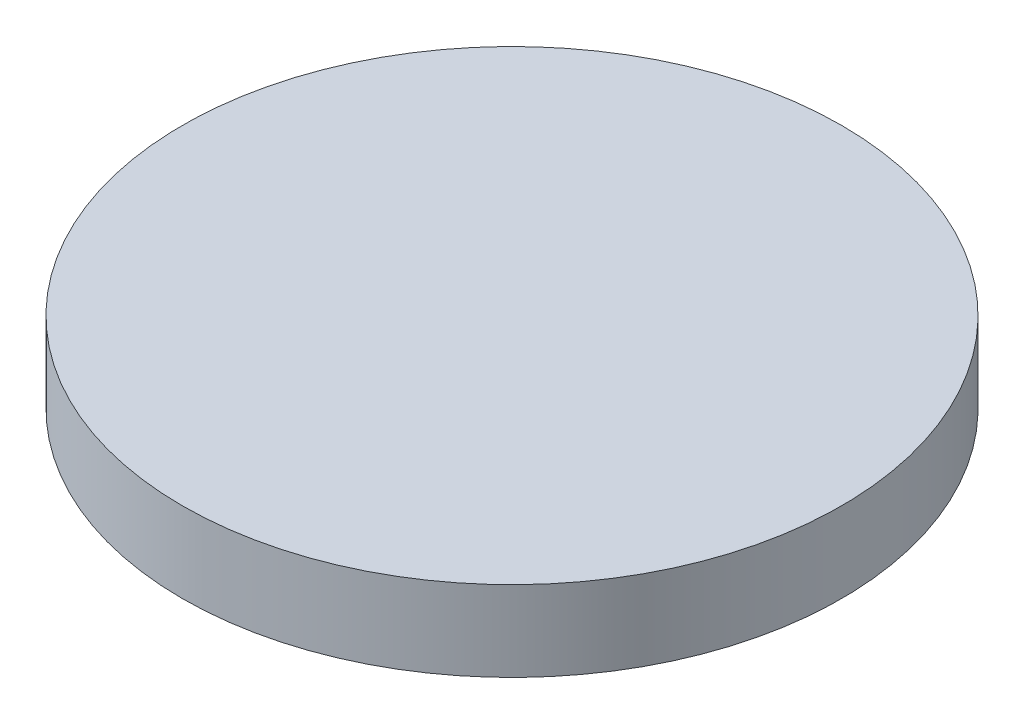
ISO-10303-21;
HEADER;
FILE_DESCRIPTION(('STEP AP214'),'2;1');
FILE_NAME('part.step','',(''),(''),'','','');
FILE_SCHEMA(('AUTOMOTIVE_DESIGN { 1 0 10303 214 1 1 1 1 }'));
ENDSEC;
DATA;
#1=APPLICATION_CONTEXT('core data for automotive mechanical design processes');
#2=APPLICATION_PROTOCOL_DEFINITION('international standard','automotive_design',2000,#1);
#3=PRODUCT_CONTEXT('',#1,'mechanical');
#4=PRODUCT('Part','Part','',(#3));
#5=PRODUCT_RELATED_PRODUCT_CATEGORY('part','',(#4));
#6=PRODUCT_DEFINITION_FORMATION('','',#4);
#7=PRODUCT_DEFINITION_CONTEXT('part definition',#1,'design');
#8=PRODUCT_DEFINITION('design','',#6,#7);
#9=PRODUCT_DEFINITION_SHAPE('','',#8);
#10=(LENGTH_UNIT() NAMED_UNIT(*) SI_UNIT(.MILLI.,.METRE.));
#11=(NAMED_UNIT(*) PLANE_ANGLE_UNIT() SI_UNIT($,.RADIAN.));
#12=(NAMED_UNIT(*) SI_UNIT($,.STERADIAN.) SOLID_ANGLE_UNIT());
#13=UNCERTAINTY_MEASURE_WITH_UNIT(LENGTH_MEASURE(1.E-05),#10,'distance_accuracy_value','');
#14=(GEOMETRIC_REPRESENTATION_CONTEXT(3) GLOBAL_UNCERTAINTY_ASSIGNED_CONTEXT((#13)) GLOBAL_UNIT_ASSIGNED_CONTEXT((#10,
#11,#12)) REPRESENTATION_CONTEXT('',''));
#15=CARTESIAN_POINT('',(0.,0.,0.));
#16=DIRECTION('',(0.,0.,1.));
#17=DIRECTION('',(1.,0.,0.));
#18=AXIS2_PLACEMENT_3D('',#15,#16,#17);
#19=CARTESIAN_POINT('',(0.,5.,0.));
#20=DIRECTION('',(0.,-1.,0.));
#21=DIRECTION('',(0.,0.,-1.));
#22=AXIS2_PLACEMENT_3D('',#19,#20,#21);
#23=CYLINDRICAL_SURFACE('',#22,20.5);
#24=CARTESIAN_POINT('',(0.,5.,0.));
#25=DIRECTION('',(0.,1.,0.));
#26=DIRECTION('',(0.,0.,1.));
#27=AXIS2_PLACEMENT_3D('',#24,#25,#26);
#28=CIRCLE('',#27,20.5);
#29=CARTESIAN_POINT('',(0.,5.,20.5));
#30=VERTEX_POINT('',#29);
#31=EDGE_CURVE('E10',#30,#30,#28,.T.);
#32=ORIENTED_EDGE('',*,*,#31,.F.);
#33=EDGE_LOOP('',(#32));
#34=FACE_BOUND('',#33,.T.);
#35=CARTESIAN_POINT('',(0.,0.,0.));
#36=DIRECTION('',(0.,1.,0.));
#37=DIRECTION('',(0.,0.,1.));
#38=AXIS2_PLACEMENT_3D('',#35,#36,#37);
#39=CIRCLE('',#38,20.5);
#40=CARTESIAN_POINT('',(0.,0.,20.5));
#41=VERTEX_POINT('',#40);
#42=EDGE_CURVE('E40',#41,#41,#39,.T.);
#43=ORIENTED_EDGE('',*,*,#42,.T.);
#44=EDGE_LOOP('',(#43));
#45=FACE_BOUND('',#44,.T.);
#46=ADVANCED_FACE('F37',(#34,#45),#23,.T.);
#47=CARTESIAN_POINT('',(0.,5.,0.));
#48=DIRECTION('',(0.,1.,0.));
#49=DIRECTION('',(0.,0.,1.));
#50=AXIS2_PLACEMENT_3D('',#47,#48,#49);
#51=PLANE('',#50);
#52=ORIENTED_EDGE('',*,*,#31,.T.);
#53=EDGE_LOOP('',(#52));
#54=FACE_BOUND('',#53,.T.);
#55=ADVANCED_FACE('F54',(#54),#51,.T.);
#56=CARTESIAN_POINT('',(0.,0.,0.));
#57=DIRECTION('',(0.,1.,0.));
#58=DIRECTION('',(0.,0.,1.));
#59=AXIS2_PLACEMENT_3D('',#56,#57,#58);
#60=PLANE('',#59);
#61=ORIENTED_EDGE('',*,*,#42,.F.);
#62=EDGE_LOOP('',(#61));
#63=FACE_BOUND('',#62,.T.);
#64=ADVANCED_FACE('F52',(#63),#60,.F.);
#65=CLOSED_SHELL('',(#46,#55,#64));
#66=MANIFOLD_SOLID_BREP('B2',#65);
#67=ADVANCED_BREP_SHAPE_REPRESENTATION('',(#18,#66),#14);
#68=SHAPE_DEFINITION_REPRESENTATION(#9,#67);
ENDSEC;
END-ISO-10303-21;
